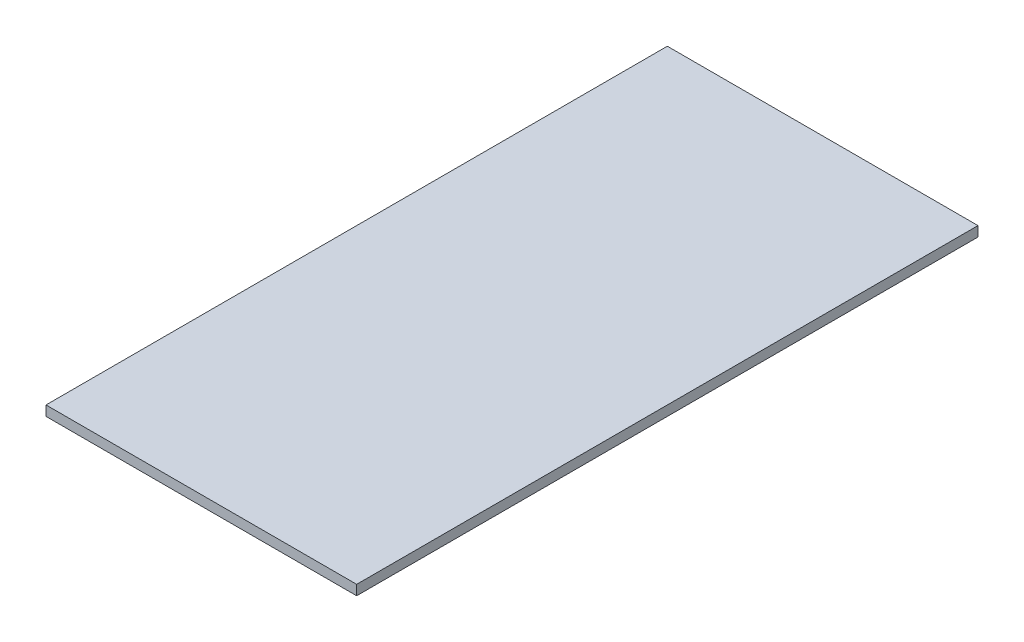
ISO-10303-21;
HEADER;
FILE_DESCRIPTION(('STEP AP214'),'2;1');
FILE_NAME('part.step','',(''),(''),'','','');
FILE_SCHEMA(('AUTOMOTIVE_DESIGN { 1 0 10303 214 1 1 1 1 }'));
ENDSEC;
DATA;
#1=APPLICATION_CONTEXT('core data for automotive mechanical design processes');
#2=APPLICATION_PROTOCOL_DEFINITION('international standard','automotive_design',2000,#1);
#3=PRODUCT_CONTEXT('',#1,'mechanical');
#4=PRODUCT('Part','Part','',(#3));
#5=PRODUCT_RELATED_PRODUCT_CATEGORY('part','',(#4));
#6=PRODUCT_DEFINITION_FORMATION('','',#4);
#7=PRODUCT_DEFINITION_CONTEXT('part definition',#1,'design');
#8=PRODUCT_DEFINITION('design','',#6,#7);
#9=PRODUCT_DEFINITION_SHAPE('','',#8);
#10=(LENGTH_UNIT() NAMED_UNIT(*) SI_UNIT(.MILLI.,.METRE.));
#11=(NAMED_UNIT(*) PLANE_ANGLE_UNIT() SI_UNIT($,.RADIAN.));
#12=(NAMED_UNIT(*) SI_UNIT($,.STERADIAN.) SOLID_ANGLE_UNIT());
#13=UNCERTAINTY_MEASURE_WITH_UNIT(LENGTH_MEASURE(1.E-05),#10,'distance_accuracy_value','');
#14=(GEOMETRIC_REPRESENTATION_CONTEXT(3) GLOBAL_UNCERTAINTY_ASSIGNED_CONTEXT((#13)) GLOBAL_UNIT_ASSIGNED_CONTEXT((#10,
#11,#12)) REPRESENTATION_CONTEXT('',''));
#15=CARTESIAN_POINT('',(0.,0.,0.));
#16=DIRECTION('',(0.,0.,1.));
#17=DIRECTION('',(1.,0.,0.));
#18=AXIS2_PLACEMENT_3D('',#15,#16,#17);
#19=CARTESIAN_POINT('',(0.,1.6,0.));
#20=DIRECTION('',(1.,0.,0.));
#21=DIRECTION('',(0.,0.,-1.));
#22=AXIS2_PLACEMENT_3D('',#19,#20,#21);
#23=PLANE('',#22);
#24=DIRECTION('',(0.,0.,1.));
#25=VECTOR('',#24,1.);
#26=CARTESIAN_POINT('',(0.,0.,0.));
#27=LINE('',#26,#25);
#28=CARTESIAN_POINT('',(0.,0.,-100.));
#29=VERTEX_POINT('',#28);
#30=CARTESIAN_POINT('',(0.,0.,0.));
#31=VERTEX_POINT('',#30);
#32=EDGE_CURVE('E102',#29,#31,#27,.T.);
#33=ORIENTED_EDGE('',*,*,#32,.T.);
#34=DIRECTION('',(0.,-1.,0.));
#35=VECTOR('',#34,1.);
#36=CARTESIAN_POINT('',(0.,1.6,0.));
#37=LINE('',#36,#35);
#38=CARTESIAN_POINT('',(0.,1.6,0.));
#39=VERTEX_POINT('',#38);
#40=EDGE_CURVE('E11',#39,#31,#37,.T.);
#41=ORIENTED_EDGE('',*,*,#40,.F.);
#42=DIRECTION('',(0.,0.,1.));
#43=VECTOR('',#42,1.);
#44=CARTESIAN_POINT('',(0.,1.6,0.));
#45=LINE('',#44,#43);
#46=CARTESIAN_POINT('',(0.,1.6,-100.));
#47=VERTEX_POINT('',#46);
#48=EDGE_CURVE('E90',#47,#39,#45,.T.);
#49=ORIENTED_EDGE('',*,*,#48,.F.);
#50=DIRECTION('',(0.,-1.,0.));
#51=VECTOR('',#50,1.);
#52=CARTESIAN_POINT('',(0.,1.6,-100.));
#53=LINE('',#52,#51);
#54=EDGE_CURVE('E98',#47,#29,#53,.T.);
#55=ORIENTED_EDGE('',*,*,#54,.T.);
#56=EDGE_LOOP('',(#33,#41,#49,#55));
#57=FACE_BOUND('',#56,.T.);
#58=ADVANCED_FACE('F39',(#57),#23,.F.);
#59=CARTESIAN_POINT('',(0.,1.6,0.));
#60=DIRECTION('',(0.,0.,-1.));
#61=DIRECTION('',(-1.,0.,0.));
#62=AXIS2_PLACEMENT_3D('',#59,#60,#61);
#63=PLANE('',#62);
#64=DIRECTION('',(1.,0.,0.));
#65=VECTOR('',#64,1.);
#66=CARTESIAN_POINT('',(0.,0.,0.));
#67=LINE('',#66,#65);
#68=CARTESIAN_POINT('',(50.,0.,0.));
#69=VERTEX_POINT('',#68);
#70=EDGE_CURVE('E94',#31,#69,#67,.T.);
#71=ORIENTED_EDGE('',*,*,#70,.T.);
#72=DIRECTION('',(0.,-1.,0.));
#73=VECTOR('',#72,1.);
#74=CARTESIAN_POINT('',(50.,1.6,0.));
#75=LINE('',#74,#73);
#76=CARTESIAN_POINT('',(50.,1.6,0.));
#77=VERTEX_POINT('',#76);
#78=EDGE_CURVE('E47',#77,#69,#75,.T.);
#79=ORIENTED_EDGE('',*,*,#78,.F.);
#80=DIRECTION('',(1.,0.,0.));
#81=VECTOR('',#80,1.);
#82=CARTESIAN_POINT('',(0.,1.6,0.));
#83=LINE('',#82,#81);
#84=EDGE_CURVE('E85',#39,#77,#83,.T.);
#85=ORIENTED_EDGE('',*,*,#84,.F.);
#86=ORIENTED_EDGE('',*,*,#40,.T.);
#87=EDGE_LOOP('',(#71,#79,#85,#86));
#88=FACE_BOUND('',#87,.T.);
#89=ADVANCED_FACE('F93',(#88),#63,.F.);
#90=CARTESIAN_POINT('',(50.,1.6,0.));
#91=DIRECTION('',(-1.,0.,0.));
#92=DIRECTION('',(0.,0.,1.));
#93=AXIS2_PLACEMENT_3D('',#90,#91,#92);
#94=PLANE('',#93);
#95=DIRECTION('',(0.,0.,-1.));
#96=VECTOR('',#95,1.);
#97=CARTESIAN_POINT('',(50.,0.,0.));
#98=LINE('',#97,#96);
#99=CARTESIAN_POINT('',(50.,0.,-100.));
#100=VERTEX_POINT('',#99);
#101=EDGE_CURVE('E72',#69,#100,#98,.T.);
#102=ORIENTED_EDGE('',*,*,#101,.T.);
#103=DIRECTION('',(0.,-1.,0.));
#104=VECTOR('',#103,1.);
#105=CARTESIAN_POINT('',(50.,1.6,-100.));
#106=LINE('',#105,#104);
#107=CARTESIAN_POINT('',(50.,1.6,-100.));
#108=VERTEX_POINT('',#107);
#109=EDGE_CURVE('E95',#108,#100,#106,.T.);
#110=ORIENTED_EDGE('',*,*,#109,.F.);
#111=DIRECTION('',(0.,0.,-1.));
#112=VECTOR('',#111,1.);
#113=CARTESIAN_POINT('',(50.,1.6,0.));
#114=LINE('',#113,#112);
#115=EDGE_CURVE('E88',#77,#108,#114,.T.);
#116=ORIENTED_EDGE('',*,*,#115,.F.);
#117=ORIENTED_EDGE('',*,*,#78,.T.);
#118=EDGE_LOOP('',(#102,#110,#116,#117));
#119=FACE_BOUND('',#118,.T.);
#120=ADVANCED_FACE('F96',(#119),#94,.F.);
#121=CARTESIAN_POINT('',(0.,1.6,-100.));
#122=DIRECTION('',(0.,0.,1.));
#123=DIRECTION('',(1.,0.,0.));
#124=AXIS2_PLACEMENT_3D('',#121,#122,#123);
#125=PLANE('',#124);
#126=DIRECTION('',(-1.,0.,0.));
#127=VECTOR('',#126,1.);
#128=CARTESIAN_POINT('',(0.,0.,-100.));
#129=LINE('',#128,#127);
#130=EDGE_CURVE('E78',#100,#29,#129,.T.);
#131=ORIENTED_EDGE('',*,*,#130,.T.);
#132=ORIENTED_EDGE('',*,*,#54,.F.);
#133=DIRECTION('',(-1.,0.,0.));
#134=VECTOR('',#133,1.);
#135=CARTESIAN_POINT('',(0.,1.6,-100.));
#136=LINE('',#135,#134);
#137=EDGE_CURVE('E55',#108,#47,#136,.T.);
#138=ORIENTED_EDGE('',*,*,#137,.F.);
#139=ORIENTED_EDGE('',*,*,#109,.T.);
#140=EDGE_LOOP('',(#131,#132,#138,#139));
#141=FACE_BOUND('',#140,.T.);
#142=ADVANCED_FACE('F109',(#141),#125,.F.);
#143=CARTESIAN_POINT('',(0.,1.6,0.));
#144=DIRECTION('',(0.,-1.,0.));
#145=DIRECTION('',(0.,0.,-1.));
#146=AXIS2_PLACEMENT_3D('',#143,#144,#145);
#147=PLANE('',#146);
#148=ORIENTED_EDGE('',*,*,#48,.T.);
#149=ORIENTED_EDGE('',*,*,#84,.T.);
#150=ORIENTED_EDGE('',*,*,#115,.T.);
#151=ORIENTED_EDGE('',*,*,#137,.T.);
#152=EDGE_LOOP('',(#148,#149,#150,#151));
#153=FACE_BOUND('',#152,.T.);
#154=ADVANCED_FACE('F86',(#153),#147,.F.);
#155=CARTESIAN_POINT('',(0.,0.,0.));
#156=DIRECTION('',(0.,-1.,0.));
#157=DIRECTION('',(0.,0.,-1.));
#158=AXIS2_PLACEMENT_3D('',#155,#156,#157);
#159=PLANE('',#158);
#160=ORIENTED_EDGE('',*,*,#32,.F.);
#161=ORIENTED_EDGE('',*,*,#130,.F.);
#162=ORIENTED_EDGE('',*,*,#101,.F.);
#163=ORIENTED_EDGE('',*,*,#70,.F.);
#164=EDGE_LOOP('',(#160,#161,#162,#163));
#165=FACE_BOUND('',#164,.T.);
#166=ADVANCED_FACE('F112',(#165),#159,.T.);
#167=CLOSED_SHELL('',(#58,#89,#120,#142,#154,#166));
#168=MANIFOLD_SOLID_BREP('B2',#167);
#169=ADVANCED_BREP_SHAPE_REPRESENTATION('',(#18,#168),#14);
#170=SHAPE_DEFINITION_REPRESENTATION(#9,#169);
ENDSEC;
END-ISO-10303-21;
